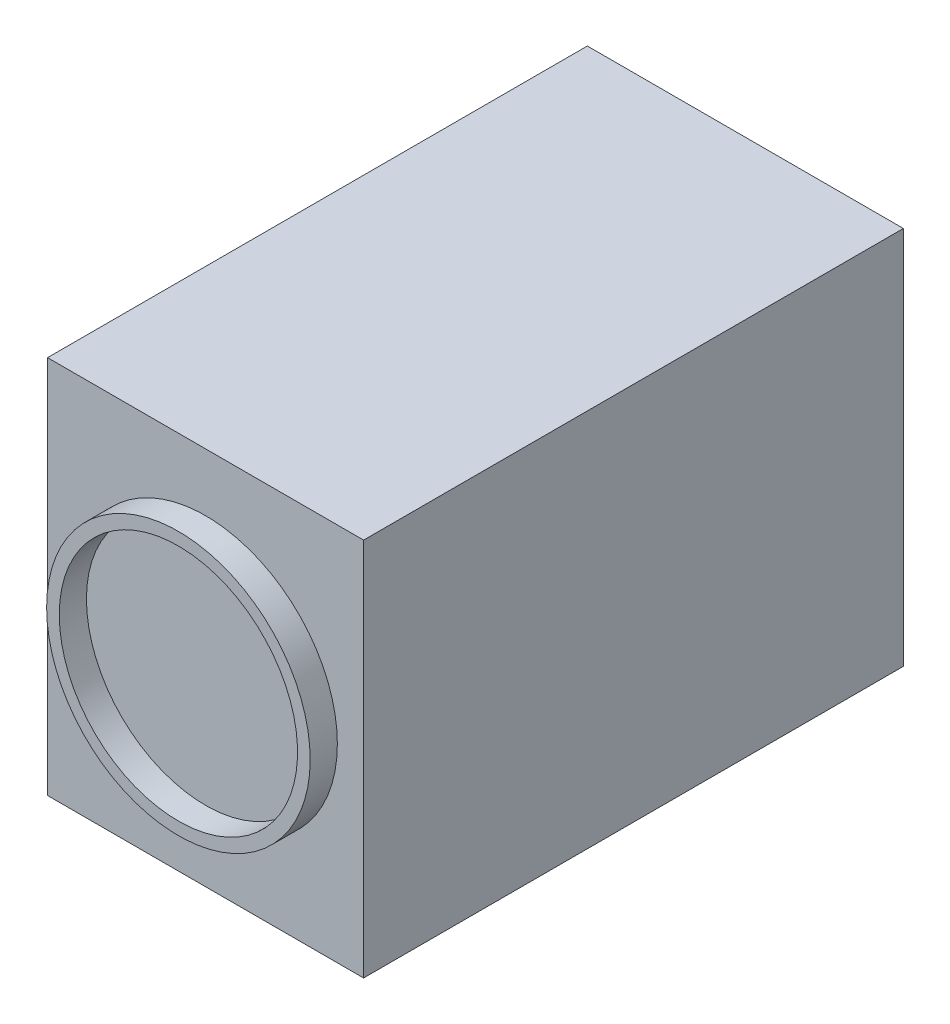
ISO-10303-21;
HEADER;
FILE_DESCRIPTION(('STEP AP214'),'2;1');
FILE_NAME('part.step','',(''),(''),'','','');
FILE_SCHEMA(('AUTOMOTIVE_DESIGN { 1 0 10303 214 1 1 1 1 }'));
ENDSEC;
DATA;
#1=APPLICATION_CONTEXT('core data for automotive mechanical design processes');
#2=APPLICATION_PROTOCOL_DEFINITION('international standard','automotive_design',2000,#1);
#3=PRODUCT_CONTEXT('',#1,'mechanical');
#4=PRODUCT('Part','Part','',(#3));
#5=PRODUCT_RELATED_PRODUCT_CATEGORY('part','',(#4));
#6=PRODUCT_DEFINITION_FORMATION('','',#4);
#7=PRODUCT_DEFINITION_CONTEXT('part definition',#1,'design');
#8=PRODUCT_DEFINITION('design','',#6,#7);
#9=PRODUCT_DEFINITION_SHAPE('','',#8);
#10=(LENGTH_UNIT() NAMED_UNIT(*) SI_UNIT(.MILLI.,.METRE.));
#11=(NAMED_UNIT(*) PLANE_ANGLE_UNIT() SI_UNIT($,.RADIAN.));
#12=(NAMED_UNIT(*) SI_UNIT($,.STERADIAN.) SOLID_ANGLE_UNIT());
#13=UNCERTAINTY_MEASURE_WITH_UNIT(LENGTH_MEASURE(1.E-05),#10,'distance_accuracy_value','');
#14=(GEOMETRIC_REPRESENTATION_CONTEXT(3) GLOBAL_UNCERTAINTY_ASSIGNED_CONTEXT((#13)) GLOBAL_UNIT_ASSIGNED_CONTEXT((#10,
#11,#12)) REPRESENTATION_CONTEXT('',''));
#15=CARTESIAN_POINT('',(0.,0.,0.));
#16=DIRECTION('',(0.,0.,1.));
#17=DIRECTION('',(1.,0.,0.));
#18=AXIS2_PLACEMENT_3D('',#15,#16,#17);
#19=CARTESIAN_POINT('',(0.,0.,85.4));
#20=DIRECTION('',(0.,0.,-1.));
#21=DIRECTION('',(-1.,0.,0.));
#22=AXIS2_PLACEMENT_3D('',#19,#20,#21);
#23=PLANE('',#22);
#24=DIRECTION('',(0.,1.,0.));
#25=VECTOR('',#24,1.);
#26=CARTESIAN_POINT('',(25.,-30.,85.4));
#27=LINE('',#26,#25);
#28=CARTESIAN_POINT('',(25.,-30.,85.4));
#29=VERTEX_POINT('',#28);
#30=CARTESIAN_POINT('',(25.,30.,85.4));
#31=VERTEX_POINT('',#30);
#32=EDGE_CURVE('E111',#29,#31,#27,.T.);
#33=ORIENTED_EDGE('',*,*,#32,.T.);
#34=DIRECTION('',(-1.,0.,0.));
#35=VECTOR('',#34,1.);
#36=CARTESIAN_POINT('',(-25.,30.,85.4));
#37=LINE('',#36,#35);
#38=CARTESIAN_POINT('',(-25.,30.,85.4));
#39=VERTEX_POINT('',#38);
#40=EDGE_CURVE('E82',#31,#39,#37,.T.);
#41=ORIENTED_EDGE('',*,*,#40,.T.);
#42=DIRECTION('',(0.,-1.,0.));
#43=VECTOR('',#42,1.);
#44=CARTESIAN_POINT('',(-25.,-30.,85.4));
#45=LINE('',#44,#43);
#46=CARTESIAN_POINT('',(-25.,-30.,85.4));
#47=VERTEX_POINT('',#46);
#48=EDGE_CURVE('E114',#39,#47,#45,.T.);
#49=ORIENTED_EDGE('',*,*,#48,.T.);
#50=DIRECTION('',(1.,0.,0.));
#51=VECTOR('',#50,1.);
#52=CARTESIAN_POINT('',(-25.,-30.,85.4));
#53=LINE('',#52,#51);
#54=EDGE_CURVE('E50',#47,#29,#53,.T.);
#55=ORIENTED_EDGE('',*,*,#54,.T.);
#56=EDGE_LOOP('',(#33,#41,#49,#55));
#57=FACE_BOUND('',#56,.T.);
#58=CARTESIAN_POINT('',(0.,0.,85.4));
#59=DIRECTION('',(0.,0.,-1.));
#60=DIRECTION('',(-1.,0.,0.));
#61=AXIS2_PLACEMENT_3D('',#58,#59,#60);
#62=CIRCLE('',#61,20.85);
#63=CARTESIAN_POINT('',(-20.85,0.,85.4));
#64=VERTEX_POINT('',#63);
#65=EDGE_CURVE('E11',#64,#64,#62,.F.);
#66=ORIENTED_EDGE('',*,*,#65,.F.);
#67=EDGE_LOOP('',(#66));
#68=FACE_BOUND('',#67,.T.);
#69=ADVANCED_FACE('F33',(#57,#68),#23,.F.);
#70=CARTESIAN_POINT('',(25.,-30.,85.4));
#71=DIRECTION('',(-1.,0.,0.));
#72=DIRECTION('',(0.,0.,1.));
#73=AXIS2_PLACEMENT_3D('',#70,#71,#72);
#74=PLANE('',#73);
#75=DIRECTION('',(0.,1.,0.));
#76=VECTOR('',#75,1.);
#77=CARTESIAN_POINT('',(25.,-30.,0.));
#78=LINE('',#77,#76);
#79=CARTESIAN_POINT('',(25.,-30.,0.));
#80=VERTEX_POINT('',#79);
#81=CARTESIAN_POINT('',(25.,30.,0.));
#82=VERTEX_POINT('',#81);
#83=EDGE_CURVE('E110',#80,#82,#78,.T.);
#84=ORIENTED_EDGE('',*,*,#83,.T.);
#85=DIRECTION('',(0.,0.,-1.));
#86=VECTOR('',#85,1.);
#87=CARTESIAN_POINT('',(25.,30.,85.4));
#88=LINE('',#87,#86);
#89=EDGE_CURVE('E42',#31,#82,#88,.T.);
#90=ORIENTED_EDGE('',*,*,#89,.F.);
#91=ORIENTED_EDGE('',*,*,#32,.F.);
#92=DIRECTION('',(0.,0.,-1.));
#93=VECTOR('',#92,1.);
#94=CARTESIAN_POINT('',(25.,-30.,85.4));
#95=LINE('',#94,#93);
#96=EDGE_CURVE('E117',#29,#80,#95,.T.);
#97=ORIENTED_EDGE('',*,*,#96,.T.);
#98=EDGE_LOOP('',(#84,#90,#91,#97));
#99=FACE_BOUND('',#98,.T.);
#100=ADVANCED_FACE('F35',(#99),#74,.F.);
#101=CARTESIAN_POINT('',(-25.,30.,85.4));
#102=DIRECTION('',(0.,-1.,0.));
#103=DIRECTION('',(0.,0.,-1.));
#104=AXIS2_PLACEMENT_3D('',#101,#102,#103);
#105=PLANE('',#104);
#106=DIRECTION('',(-1.,0.,0.));
#107=VECTOR('',#106,1.);
#108=CARTESIAN_POINT('',(-25.,30.,0.));
#109=LINE('',#108,#107);
#110=CARTESIAN_POINT('',(-25.,30.,0.));
#111=VERTEX_POINT('',#110);
#112=EDGE_CURVE('E120',#82,#111,#109,.T.);
#113=ORIENTED_EDGE('',*,*,#112,.T.);
#114=DIRECTION('',(0.,0.,-1.));
#115=VECTOR('',#114,1.);
#116=CARTESIAN_POINT('',(-25.,30.,85.4));
#117=LINE('',#116,#115);
#118=EDGE_CURVE('E127',#39,#111,#117,.T.);
#119=ORIENTED_EDGE('',*,*,#118,.F.);
#120=ORIENTED_EDGE('',*,*,#40,.F.);
#121=ORIENTED_EDGE('',*,*,#89,.T.);
#122=EDGE_LOOP('',(#113,#119,#120,#121));
#123=FACE_BOUND('',#122,.T.);
#124=ADVANCED_FACE('F129',(#123),#105,.F.);
#125=CARTESIAN_POINT('',(-25.,-30.,85.4));
#126=DIRECTION('',(1.,0.,0.));
#127=DIRECTION('',(0.,0.,-1.));
#128=AXIS2_PLACEMENT_3D('',#125,#126,#127);
#129=PLANE('',#128);
#130=DIRECTION('',(0.,-1.,0.));
#131=VECTOR('',#130,1.);
#132=CARTESIAN_POINT('',(-25.,-30.,0.));
#133=LINE('',#132,#131);
#134=CARTESIAN_POINT('',(-25.,-30.,0.));
#135=VERTEX_POINT('',#134);
#136=EDGE_CURVE('E68',#111,#135,#133,.T.);
#137=ORIENTED_EDGE('',*,*,#136,.T.);
#138=DIRECTION('',(0.,0.,-1.));
#139=VECTOR('',#138,1.);
#140=CARTESIAN_POINT('',(-25.,-30.,85.4));
#141=LINE('',#140,#139);
#142=EDGE_CURVE('E125',#47,#135,#141,.T.);
#143=ORIENTED_EDGE('',*,*,#142,.F.);
#144=ORIENTED_EDGE('',*,*,#48,.F.);
#145=ORIENTED_EDGE('',*,*,#118,.T.);
#146=EDGE_LOOP('',(#137,#143,#144,#145));
#147=FACE_BOUND('',#146,.T.);
#148=ADVANCED_FACE('F146',(#147),#129,.F.);
#149=CARTESIAN_POINT('',(-25.,-30.,85.4));
#150=DIRECTION('',(0.,1.,0.));
#151=DIRECTION('',(0.,0.,1.));
#152=AXIS2_PLACEMENT_3D('',#149,#150,#151);
#153=PLANE('',#152);
#154=CARTESIAN_POINT('',(0.,-30.,67.85));
#155=DIRECTION('',(0.,-1.,0.));
#156=DIRECTION('',(0.,0.,-1.));
#157=AXIS2_PLACEMENT_3D('',#154,#155,#156);
#158=CIRCLE('',#157,2.55269999999998);
#159=CARTESIAN_POINT('',(0.,-30.,65.2973));
#160=VERTEX_POINT('',#159);
#161=EDGE_CURVE('E97',#160,#160,#158,.T.);
#162=ORIENTED_EDGE('',*,*,#161,.F.);
#163=EDGE_LOOP('',(#162));
#164=FACE_BOUND('',#163,.T.);
#165=DIRECTION('',(1.,0.,0.));
#166=VECTOR('',#165,1.);
#167=CARTESIAN_POINT('',(-25.,-30.,0.));
#168=LINE('',#167,#166);
#169=EDGE_CURVE('E74',#135,#80,#168,.T.);
#170=ORIENTED_EDGE('',*,*,#169,.T.);
#171=ORIENTED_EDGE('',*,*,#96,.F.);
#172=ORIENTED_EDGE('',*,*,#54,.F.);
#173=ORIENTED_EDGE('',*,*,#142,.T.);
#174=EDGE_LOOP('',(#170,#171,#172,#173));
#175=FACE_BOUND('',#174,.T.);
#176=ADVANCED_FACE('F137',(#164,#175),#153,.F.);
#177=CARTESIAN_POINT('',(0.,0.,0.));
#178=DIRECTION('',(0.,0.,-1.));
#179=DIRECTION('',(-1.,0.,0.));
#180=AXIS2_PLACEMENT_3D('',#177,#178,#179);
#181=PLANE('',#180);
#182=ORIENTED_EDGE('',*,*,#83,.F.);
#183=ORIENTED_EDGE('',*,*,#169,.F.);
#184=ORIENTED_EDGE('',*,*,#136,.F.);
#185=ORIENTED_EDGE('',*,*,#112,.F.);
#186=EDGE_LOOP('',(#182,#183,#184,#185));
#187=FACE_BOUND('',#186,.T.);
#188=ADVANCED_FACE('F134',(#187),#181,.T.);
#189=CARTESIAN_POINT('',(0.,0.,89.7));
#190=DIRECTION('',(0.,0.,1.));
#191=DIRECTION('',(1.,0.,0.));
#192=AXIS2_PLACEMENT_3D('',#189,#190,#191);
#193=PLANE('',#192);
#194=CARTESIAN_POINT('',(0.,0.,89.7));
#195=DIRECTION('',(0.,0.,1.));
#196=DIRECTION('',(1.,0.,0.));
#197=AXIS2_PLACEMENT_3D('',#194,#195,#196);
#198=CIRCLE('',#197,20.85);
#199=CARTESIAN_POINT('',(-20.85,0.,89.7));
#200=VERTEX_POINT('',#199);
#201=EDGE_CURVE('E106',#200,#200,#198,.T.);
#202=ORIENTED_EDGE('',*,*,#201,.T.);
#203=EDGE_LOOP('',(#202));
#204=FACE_BOUND('',#203,.T.);
#205=CARTESIAN_POINT('',(0.,0.,89.7));
#206=DIRECTION('',(0.,0.,1.));
#207=DIRECTION('',(1.,0.,0.));
#208=AXIS2_PLACEMENT_3D('',#205,#206,#207);
#209=CIRCLE('',#208,18.85);
#210=CARTESIAN_POINT('',(-18.85,0.,89.7));
#211=VERTEX_POINT('',#210);
#212=EDGE_CURVE('E100',#211,#211,#209,.T.);
#213=ORIENTED_EDGE('',*,*,#212,.F.);
#214=EDGE_LOOP('',(#213));
#215=FACE_BOUND('',#214,.T.);
#216=ADVANCED_FACE('F136',(#204,#215),#193,.T.);
#217=CARTESIAN_POINT('',(0.,0.,89.7));
#218=DIRECTION('',(0.,0.,-1.));
#219=DIRECTION('',(-1.,0.,0.));
#220=AXIS2_PLACEMENT_3D('',#217,#218,#219);
#221=CYLINDRICAL_SURFACE('',#220,20.85);
#222=CARTESIAN_POINT('',(-20.85,0.,89.7));
#223=CARTESIAN_POINT('',(-20.85,0.,89.6552083333333));
#224=CARTESIAN_POINT('',(-20.85,0.,89.6104166666667));
#225=CARTESIAN_POINT('',(-20.85,0.,89.5208333333333));
#226=CARTESIAN_POINT('',(-20.85,0.,89.4760416666667));
#227=CARTESIAN_POINT('',(-20.85,0.,89.3864583333333));
#228=CARTESIAN_POINT('',(-20.85,0.,89.3416666666667));
#229=CARTESIAN_POINT('',(-20.85,0.,89.2520833333333));
#230=CARTESIAN_POINT('',(-20.85,0.,89.2072916666667));
#231=CARTESIAN_POINT('',(-20.85,0.,89.1177083333333));
#232=CARTESIAN_POINT('',(-20.85,0.,89.0729166666667));
#233=CARTESIAN_POINT('',(-20.85,0.,88.9833333333333));
#234=CARTESIAN_POINT('',(-20.85,0.,88.9385416666667));
#235=CARTESIAN_POINT('',(-20.85,0.,88.8489583333333));
#236=CARTESIAN_POINT('',(-20.85,0.,88.8041666666667));
#237=CARTESIAN_POINT('',(-20.85,0.,88.7145833333333));
#238=CARTESIAN_POINT('',(-20.85,0.,88.6697916666667));
#239=CARTESIAN_POINT('',(-20.85,0.,88.5802083333333));
#240=CARTESIAN_POINT('',(-20.85,0.,88.5354166666667));
#241=CARTESIAN_POINT('',(-20.85,0.,88.4458333333333));
#242=CARTESIAN_POINT('',(-20.85,0.,88.4010416666667));
#243=CARTESIAN_POINT('',(-20.85,0.,88.3114583333333));
#244=CARTESIAN_POINT('',(-20.85,0.,88.2666666666667));
#245=CARTESIAN_POINT('',(-20.85,0.,88.1770833333333));
#246=CARTESIAN_POINT('',(-20.85,0.,88.1322916666667));
#247=CARTESIAN_POINT('',(-20.85,0.,88.0427083333333));
#248=CARTESIAN_POINT('',(-20.85,0.,87.9979166666667));
#249=CARTESIAN_POINT('',(-20.85,0.,87.9083333333333));
#250=CARTESIAN_POINT('',(-20.85,0.,87.8635416666667));
#251=CARTESIAN_POINT('',(-20.85,0.,87.7739583333333));
#252=CARTESIAN_POINT('',(-20.85,0.,87.7291666666667));
#253=CARTESIAN_POINT('',(-20.85,0.,87.6395833333333));
#254=CARTESIAN_POINT('',(-20.85,0.,87.5947916666667));
#255=CARTESIAN_POINT('',(-20.85,0.,87.5052083333333));
#256=CARTESIAN_POINT('',(-20.85,0.,87.4604166666667));
#257=CARTESIAN_POINT('',(-20.85,0.,87.3708333333333));
#258=CARTESIAN_POINT('',(-20.85,0.,87.3260416666667));
#259=CARTESIAN_POINT('',(-20.85,0.,87.2364583333333));
#260=CARTESIAN_POINT('',(-20.85,0.,87.1916666666667));
#261=CARTESIAN_POINT('',(-20.85,0.,87.1020833333333));
#262=CARTESIAN_POINT('',(-20.85,0.,87.0572916666667));
#263=CARTESIAN_POINT('',(-20.85,0.,86.9677083333333));
#264=CARTESIAN_POINT('',(-20.85,0.,86.9229166666667));
#265=CARTESIAN_POINT('',(-20.85,0.,86.8333333333333));
#266=CARTESIAN_POINT('',(-20.85,0.,86.7885416666667));
#267=CARTESIAN_POINT('',(-20.85,0.,86.6989583333333));
#268=CARTESIAN_POINT('',(-20.85,0.,86.6541666666667));
#269=CARTESIAN_POINT('',(-20.85,0.,86.5645833333333));
#270=CARTESIAN_POINT('',(-20.85,0.,86.5197916666667));
#271=CARTESIAN_POINT('',(-20.85,0.,86.4302083333333));
#272=CARTESIAN_POINT('',(-20.85,0.,86.3854166666667));
#273=CARTESIAN_POINT('',(-20.85,0.,86.2958333333333));
#274=CARTESIAN_POINT('',(-20.85,0.,86.2510416666667));
#275=CARTESIAN_POINT('',(-20.85,0.,86.1614583333333));
#276=CARTESIAN_POINT('',(-20.85,0.,86.1166666666667));
#277=CARTESIAN_POINT('',(-20.85,0.,86.0270833333333));
#278=CARTESIAN_POINT('',(-20.85,0.,85.9822916666667));
#279=CARTESIAN_POINT('',(-20.85,0.,85.8927083333333));
#280=CARTESIAN_POINT('',(-20.85,0.,85.8479166666667));
#281=CARTESIAN_POINT('',(-20.85,0.,85.7583333333333));
#282=CARTESIAN_POINT('',(-20.85,0.,85.7135416666667));
#283=CARTESIAN_POINT('',(-20.85,0.,85.6239583333333));
#284=CARTESIAN_POINT('',(-20.85,0.,85.5791666666667));
#285=CARTESIAN_POINT('',(-20.85,0.,85.4895833333333));
#286=CARTESIAN_POINT('',(-20.85,0.,85.4447916666667));
#287=CARTESIAN_POINT('',(-20.85,0.,85.4));
#288=B_SPLINE_CURVE_WITH_KNOTS('',3,(#222,#223,#224,#225,#226,#227,#228,#229,#230,#231,#232,
#233,#234,#235,#236,#237,#238,#239,#240,#241,#242,#243,#244,#245,#246,#247,#248,#249,#250,#251,
#252,#253,#254,#255,#256,#257,#258,#259,#260,#261,#262,#263,#264,#265,#266,#267,#268,#269,#270,
#271,#272,#273,#274,#275,#276,#277,#278,#279,#280,#281,#282,#283,#284,#285,#286,#287),
.UNSPECIFIED.,.F.,.F.,(4,2,2,2,2,2,2,2,2,2,2,2,2,2,2,2,2,2,2,2,2,2,2,2,2,2,2,2,2,2,2,2,4),(0.,
0.134374999999992,0.268749999999998,0.40312499999999,0.537499999999996,0.671874999999988,
0.806249999999994,0.940624999999987,1.07499999999999,1.20937499999998,1.34374999999999,
1.47812499999998,1.61249999999999,1.74687499999998,1.88124999999999,2.01562499999998,
2.14999999999999,2.28437499999999,2.41874999999998,2.55312499999999,2.68749999999998,
2.82187499999999,2.95624999999998,3.09062499999999,3.22499999999998,3.35937499999998,
3.49374999999998,3.62812499999998,3.76249999999997,3.89687499999998,4.03124999999997,
4.16562499999998,4.29999999999997),.UNSPECIFIED.);
#289=EDGE_CURVE('BSEAM143',#200,#64,#288,.T.);
#290=ORIENTED_EDGE('',*,*,#201,.F.);
#291=ORIENTED_EDGE('',*,*,#65,.T.);
#292=ORIENTED_EDGE('',*,*,#289,.T.);
#293=ORIENTED_EDGE('',*,*,#289,.F.);
#294=EDGE_LOOP('',(#290,#292,#291,#293));
#295=FACE_BOUND('',#294,.T.);
#296=ADVANCED_FACE('F143',(#295),#221,.T.);
#297=CARTESIAN_POINT('',(0.,0.,89.7));
#298=DIRECTION('',(0.,0.,-1.));
#299=DIRECTION('',(-1.,0.,0.));
#300=AXIS2_PLACEMENT_3D('',#297,#298,#299);
#301=CYLINDRICAL_SURFACE('',#300,18.85);
#302=CARTESIAN_POINT('',(0.,0.,85.4));
#303=DIRECTION('',(0.,0.,1.));
#304=DIRECTION('',(1.,0.,0.));
#305=AXIS2_PLACEMENT_3D('',#302,#303,#304);
#306=CIRCLE('',#305,18.85);
#307=CARTESIAN_POINT('',(-18.85,0.,85.4));
#308=VERTEX_POINT('',#307);
#309=EDGE_CURVE('E96',#308,#308,#306,.T.);
#310=CARTESIAN_POINT('',(-18.85,0.,89.7));
#311=CARTESIAN_POINT('',(-18.85,0.,89.6552083333333));
#312=CARTESIAN_POINT('',(-18.85,0.,89.6104166666667));
#313=CARTESIAN_POINT('',(-18.85,0.,89.5208333333333));
#314=CARTESIAN_POINT('',(-18.85,0.,89.4760416666667));
#315=CARTESIAN_POINT('',(-18.85,0.,89.3864583333333));
#316=CARTESIAN_POINT('',(-18.85,0.,89.3416666666667));
#317=CARTESIAN_POINT('',(-18.85,0.,89.2520833333333));
#318=CARTESIAN_POINT('',(-18.85,0.,89.2072916666667));
#319=CARTESIAN_POINT('',(-18.85,0.,89.1177083333333));
#320=CARTESIAN_POINT('',(-18.85,0.,89.0729166666667));
#321=CARTESIAN_POINT('',(-18.85,0.,88.9833333333333));
#322=CARTESIAN_POINT('',(-18.85,0.,88.9385416666667));
#323=CARTESIAN_POINT('',(-18.85,0.,88.8489583333333));
#324=CARTESIAN_POINT('',(-18.85,0.,88.8041666666667));
#325=CARTESIAN_POINT('',(-18.85,0.,88.7145833333333));
#326=CARTESIAN_POINT('',(-18.85,0.,88.6697916666667));
#327=CARTESIAN_POINT('',(-18.85,0.,88.5802083333333));
#328=CARTESIAN_POINT('',(-18.85,0.,88.5354166666667));
#329=CARTESIAN_POINT('',(-18.85,0.,88.4458333333333));
#330=CARTESIAN_POINT('',(-18.85,0.,88.4010416666667));
#331=CARTESIAN_POINT('',(-18.85,0.,88.3114583333333));
#332=CARTESIAN_POINT('',(-18.85,0.,88.2666666666667));
#333=CARTESIAN_POINT('',(-18.85,0.,88.1770833333333));
#334=CARTESIAN_POINT('',(-18.85,0.,88.1322916666667));
#335=CARTESIAN_POINT('',(-18.85,0.,88.0427083333333));
#336=CARTESIAN_POINT('',(-18.85,0.,87.9979166666667));
#337=CARTESIAN_POINT('',(-18.85,0.,87.9083333333333));
#338=CARTESIAN_POINT('',(-18.85,0.,87.8635416666667));
#339=CARTESIAN_POINT('',(-18.85,0.,87.7739583333333));
#340=CARTESIAN_POINT('',(-18.85,0.,87.7291666666667));
#341=CARTESIAN_POINT('',(-18.85,0.,87.6395833333333));
#342=CARTESIAN_POINT('',(-18.85,0.,87.5947916666667));
#343=CARTESIAN_POINT('',(-18.85,0.,87.5052083333333));
#344=CARTESIAN_POINT('',(-18.85,0.,87.4604166666667));
#345=CARTESIAN_POINT('',(-18.85,0.,87.3708333333333));
#346=CARTESIAN_POINT('',(-18.85,0.,87.3260416666667));
#347=CARTESIAN_POINT('',(-18.85,0.,87.2364583333333));
#348=CARTESIAN_POINT('',(-18.85,0.,87.1916666666667));
#349=CARTESIAN_POINT('',(-18.85,0.,87.1020833333333));
#350=CARTESIAN_POINT('',(-18.85,0.,87.0572916666667));
#351=CARTESIAN_POINT('',(-18.85,0.,86.9677083333333));
#352=CARTESIAN_POINT('',(-18.85,0.,86.9229166666667));
#353=CARTESIAN_POINT('',(-18.85,0.,86.8333333333333));
#354=CARTESIAN_POINT('',(-18.85,0.,86.7885416666667));
#355=CARTESIAN_POINT('',(-18.85,0.,86.6989583333333));
#356=CARTESIAN_POINT('',(-18.85,0.,86.6541666666667));
#357=CARTESIAN_POINT('',(-18.85,0.,86.5645833333333));
#358=CARTESIAN_POINT('',(-18.85,0.,86.5197916666667));
#359=CARTESIAN_POINT('',(-18.85,0.,86.4302083333333));
#360=CARTESIAN_POINT('',(-18.85,0.,86.3854166666667));
#361=CARTESIAN_POINT('',(-18.85,0.,86.2958333333333));
#362=CARTESIAN_POINT('',(-18.85,0.,86.2510416666667));
#363=CARTESIAN_POINT('',(-18.85,0.,86.1614583333333));
#364=CARTESIAN_POINT('',(-18.85,0.,86.1166666666667));
#365=CARTESIAN_POINT('',(-18.85,0.,86.0270833333333));
#366=CARTESIAN_POINT('',(-18.85,0.,85.9822916666667));
#367=CARTESIAN_POINT('',(-18.85,0.,85.8927083333333));
#368=CARTESIAN_POINT('',(-18.85,0.,85.8479166666667));
#369=CARTESIAN_POINT('',(-18.85,0.,85.7583333333333));
#370=CARTESIAN_POINT('',(-18.85,0.,85.7135416666667));
#371=CARTESIAN_POINT('',(-18.85,0.,85.6239583333333));
#372=CARTESIAN_POINT('',(-18.85,0.,85.5791666666667));
#373=CARTESIAN_POINT('',(-18.85,0.,85.4895833333333));
#374=CARTESIAN_POINT('',(-18.85,0.,85.4447916666667));
#375=CARTESIAN_POINT('',(-18.85,0.,85.4));
#376=B_SPLINE_CURVE_WITH_KNOTS('',3,(#310,#311,#312,#313,#314,#315,#316,#317,#318,#319,#320,
#321,#322,#323,#324,#325,#326,#327,#328,#329,#330,#331,#332,#333,#334,#335,#336,#337,#338,#339,
#340,#341,#342,#343,#344,#345,#346,#347,#348,#349,#350,#351,#352,#353,#354,#355,#356,#357,#358,
#359,#360,#361,#362,#363,#364,#365,#366,#367,#368,#369,#370,#371,#372,#373,#374,#375),
.UNSPECIFIED.,.F.,.F.,(4,2,2,2,2,2,2,2,2,2,2,2,2,2,2,2,2,2,2,2,2,2,2,2,2,2,2,2,2,2,2,2,4),(0.,
0.134375000000006,0.268750000000012,0.403125000000004,0.53750000000001,0.671875000000002,
0.806250000000008,0.940625,1.07500000000001,1.20937500000001,1.34375,1.47812500000001,1.6125,
1.74687500000001,1.88125,2.01562500000001,2.15000000000001,2.28437500000001,2.41875000000001,
2.553125,2.68750000000001,2.821875,2.95625000000001,3.09062500000001,3.22500000000001,
3.35937500000001,3.49375,3.62812500000001,3.7625,3.89687500000001,4.03125,4.16562500000001,
4.30000000000001),.UNSPECIFIED.);
#377=EDGE_CURVE('BSEAM157',#211,#308,#376,.T.);
#378=ORIENTED_EDGE('',*,*,#212,.T.);
#379=ORIENTED_EDGE('',*,*,#309,.F.);
#380=ORIENTED_EDGE('',*,*,#377,.T.);
#381=ORIENTED_EDGE('',*,*,#377,.F.);
#382=EDGE_LOOP('',(#378,#380,#379,#381));
#383=FACE_BOUND('',#382,.T.);
#384=ADVANCED_FACE('F157',(#383),#301,.F.);
#385=ORIENTED_EDGE('',*,*,#309,.T.);
#386=EDGE_LOOP('',(#385));
#387=FACE_BOUND('',#386,.T.);
#388=ADVANCED_FACE('F90',(#387),#23,.F.);
#389=CARTESIAN_POINT('',(0.,-19.84,67.85));
#390=DIRECTION('',(0.,-1.,0.));
#391=DIRECTION('',(0.,0.,-1.));
#392=AXIS2_PLACEMENT_3D('',#389,#390,#391);
#393=CONICAL_SURFACE('',#392,2.5527,1.02974425867665);
#394=CARTESIAN_POINT('',(0.,-18.3061830978083,67.85));
#395=VERTEX_POINT('',#394);
#396=VERTEX_LOOP('',#395);
#397=FACE_BOUND('',#396,.T.);
#398=CARTESIAN_POINT('',(0.,-19.84,67.85));
#399=DIRECTION('',(0.,-1.,0.));
#400=DIRECTION('',(0.,0.,-1.));
#401=AXIS2_PLACEMENT_3D('',#398,#399,#400);
#402=CIRCLE('',#401,2.5527);
#403=CARTESIAN_POINT('',(0.,-19.84,65.2973));
#404=VERTEX_POINT('',#403);
#405=EDGE_CURVE('E94',#404,#404,#402,.T.);
#406=ORIENTED_EDGE('',*,*,#405,.T.);
#407=EDGE_LOOP('',(#406));
#408=FACE_BOUND('',#407,.T.);
#409=ADVANCED_FACE('F86',(#397,#408),#393,.F.);
#410=CARTESIAN_POINT('',(0.,-30.,67.85));
#411=DIRECTION('',(0.,-1.,0.));
#412=DIRECTION('',(0.,0.,-1.));
#413=AXIS2_PLACEMENT_3D('',#410,#411,#412);
#414=CYLINDRICAL_SURFACE('',#413,2.55269999999999);
#415=ORIENTED_EDGE('',*,*,#405,.F.);
#416=EDGE_LOOP('',(#415));
#417=FACE_BOUND('',#416,.T.);
#418=ORIENTED_EDGE('',*,*,#161,.T.);
#419=EDGE_LOOP('',(#418));
#420=FACE_BOUND('',#419,.T.);
#421=ADVANCED_FACE('F89',(#417,#420),#414,.F.);
#422=CLOSED_SHELL('',(#69,#100,#124,#148,#176,#188,#216,#296,#384,#388,#409,#421));
#423=MANIFOLD_SOLID_BREP('B2',#422);
#424=ADVANCED_BREP_SHAPE_REPRESENTATION('',(#18,#423),#14);
#425=SHAPE_DEFINITION_REPRESENTATION(#9,#424);
ENDSEC;
END-ISO-10303-21;
